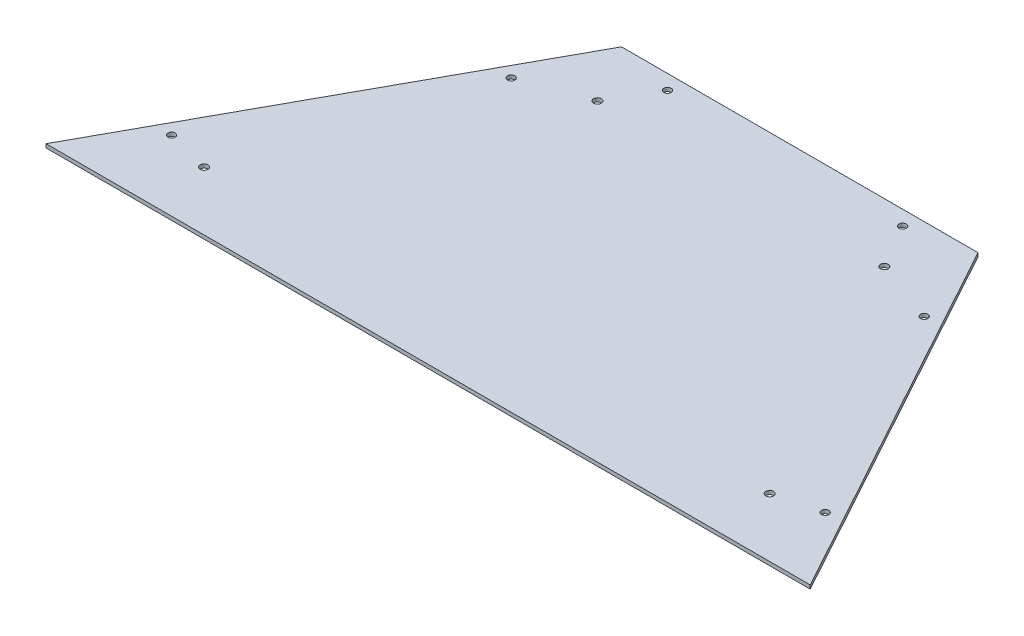
ISO-10303-21;
HEADER;
FILE_DESCRIPTION(('STEP AP214'),'2;1');
FILE_NAME('part.step','',(''),(''),'','','');
FILE_SCHEMA(('AUTOMOTIVE_DESIGN { 1 0 10303 214 1 1 1 1 }'));
ENDSEC;
DATA;
#1=APPLICATION_CONTEXT('core data for automotive mechanical design processes');
#2=APPLICATION_PROTOCOL_DEFINITION('international standard','automotive_design',2000,#1);
#3=PRODUCT_CONTEXT('',#1,'mechanical');
#4=PRODUCT('Part','Part','',(#3));
#5=PRODUCT_RELATED_PRODUCT_CATEGORY('part','',(#4));
#6=PRODUCT_DEFINITION_FORMATION('','',#4);
#7=PRODUCT_DEFINITION_CONTEXT('part definition',#1,'design');
#8=PRODUCT_DEFINITION('design','',#6,#7);
#9=PRODUCT_DEFINITION_SHAPE('','',#8);
#10=(LENGTH_UNIT() NAMED_UNIT(*) SI_UNIT(.MILLI.,.METRE.));
#11=(NAMED_UNIT(*) PLANE_ANGLE_UNIT() SI_UNIT($,.RADIAN.));
#12=(NAMED_UNIT(*) SI_UNIT($,.STERADIAN.) SOLID_ANGLE_UNIT());
#13=UNCERTAINTY_MEASURE_WITH_UNIT(LENGTH_MEASURE(1.E-05),#10,'distance_accuracy_value','');
#14=(GEOMETRIC_REPRESENTATION_CONTEXT(3) GLOBAL_UNCERTAINTY_ASSIGNED_CONTEXT((#13)) GLOBAL_UNIT_ASSIGNED_CONTEXT((#10,
#11,#12)) REPRESENTATION_CONTEXT('',''));
#15=CARTESIAN_POINT('',(0.,0.,0.));
#16=DIRECTION('',(0.,0.,1.));
#17=DIRECTION('',(1.,0.,0.));
#18=AXIS2_PLACEMENT_3D('',#15,#16,#17);
#19=CARTESIAN_POINT('',(0.,3.175,0.));
#20=DIRECTION('',(0.,-1.,0.));
#21=DIRECTION('',(0.,0.,-1.));
#22=AXIS2_PLACEMENT_3D('',#19,#20,#21);
#23=PLANE('',#22);
#24=CARTESIAN_POINT('',(-244.348,3.175,-50.7999999999999));
#25=DIRECTION('',(0.,1.,0.));
#26=DIRECTION('',(0.,0.,1.));
#27=AXIS2_PLACEMENT_3D('',#24,#25,#26);
#28=CIRCLE('',#27,3.37819999999989);
#29=CARTESIAN_POINT('',(-244.348,3.175,-47.4218));
#30=VERTEX_POINT('',#29);
#31=EDGE_CURVE('E164',#30,#30,#28,.T.);
#32=ORIENTED_EDGE('',*,*,#31,.F.);
#33=EDGE_LOOP('',(#32));
#34=FACE_BOUND('',#33,.T.);
#35=CARTESIAN_POINT('',(244.348,3.175,-50.7999999999999));
#36=DIRECTION('',(0.,1.,0.));
#37=DIRECTION('',(0.,0.,1.));
#38=AXIS2_PLACEMENT_3D('',#35,#36,#37);
#39=CIRCLE('',#38,3.37819999999989);
#40=CARTESIAN_POINT('',(244.348,3.175,-47.4218));
#41=VERTEX_POINT('',#40);
#42=EDGE_CURVE('E158',#41,#41,#39,.T.);
#43=ORIENTED_EDGE('',*,*,#42,.F.);
#44=EDGE_LOOP('',(#43));
#45=FACE_BOUND('',#44,.T.);
#46=CARTESIAN_POINT('',(123.952,3.175,-270.256));
#47=DIRECTION('',(0.,1.,0.));
#48=DIRECTION('',(0.,0.,1.));
#49=AXIS2_PLACEMENT_3D('',#46,#47,#48);
#50=CIRCLE('',#49,3.37819999999989);
#51=CARTESIAN_POINT('',(123.952,3.175,-266.8778));
#52=VERTEX_POINT('',#51);
#53=EDGE_CURVE('E152',#52,#52,#50,.T.);
#54=ORIENTED_EDGE('',*,*,#53,.F.);
#55=EDGE_LOOP('',(#54));
#56=FACE_BOUND('',#55,.T.);
#57=CARTESIAN_POINT('',(-282.418345658024,3.175,-60.7012644707171));
#58=DIRECTION('',(0.,1.,0.));
#59=DIRECTION('',(0.,0.,1.));
#60=AXIS2_PLACEMENT_3D('',#57,#58,#59);
#61=CIRCLE('',#60,3.17499999999987);
#62=CARTESIAN_POINT('',(-282.418345658024,3.175,-57.5262644707173));
#63=VERTEX_POINT('',#62);
#64=EDGE_CURVE('E146',#63,#63,#61,.T.);
#65=ORIENTED_EDGE('',*,*,#64,.F.);
#66=EDGE_LOOP('',(#65));
#67=FACE_BOUND('',#66,.T.);
#68=CARTESIAN_POINT('',(-178.463561330701,3.175,-250.216315407205));
#69=DIRECTION('',(0.,1.,0.));
#70=DIRECTION('',(0.,0.,1.));
#71=AXIS2_PLACEMENT_3D('',#68,#69,#70);
#72=CIRCLE('',#71,3.1749999999999);
#73=CARTESIAN_POINT('',(-178.463561330701,3.175,-247.041315407205));
#74=VERTEX_POINT('',#73);
#75=EDGE_CURVE('E140',#74,#74,#72,.T.);
#76=ORIENTED_EDGE('',*,*,#75,.F.);
#77=EDGE_LOOP('',(#76));
#78=FACE_BOUND('',#77,.T.);
#79=CARTESIAN_POINT('',(-101.6,3.175,-308.42891122258));
#80=DIRECTION('',(0.,1.,0.));
#81=DIRECTION('',(0.,0.,1.));
#82=AXIS2_PLACEMENT_3D('',#79,#80,#81);
#83=CIRCLE('',#82,3.17499999999989);
#84=CARTESIAN_POINT('',(-101.6,3.175,-305.253911222581));
#85=VERTEX_POINT('',#84);
#86=EDGE_CURVE('E134',#85,#85,#83,.T.);
#87=ORIENTED_EDGE('',*,*,#86,.F.);
#88=EDGE_LOOP('',(#87));
#89=FACE_BOUND('',#88,.T.);
#90=CARTESIAN_POINT('',(282.418345658024,3.175,-60.7012644707171));
#91=DIRECTION('',(0.,1.,0.));
#92=DIRECTION('',(0.,0.,1.));
#93=AXIS2_PLACEMENT_3D('',#90,#91,#92);
#94=CIRCLE('',#93,3.17499999999987);
#95=CARTESIAN_POINT('',(282.418345658024,3.175,-57.5262644707172));
#96=VERTEX_POINT('',#95);
#97=EDGE_CURVE('E128',#96,#96,#94,.T.);
#98=ORIENTED_EDGE('',*,*,#97,.F.);
#99=EDGE_LOOP('',(#98));
#100=FACE_BOUND('',#99,.T.);
#101=CARTESIAN_POINT('',(178.463561330701,3.175,-250.216315407205));
#102=DIRECTION('',(0.,1.,0.));
#103=DIRECTION('',(0.,0.,1.));
#104=AXIS2_PLACEMENT_3D('',#101,#102,#103);
#105=CIRCLE('',#104,3.1749999999999);
#106=CARTESIAN_POINT('',(178.463561330701,3.175,-247.041315407205));
#107=VERTEX_POINT('',#106);
#108=EDGE_CURVE('E122',#107,#107,#105,.T.);
#109=ORIENTED_EDGE('',*,*,#108,.F.);
#110=EDGE_LOOP('',(#109));
#111=FACE_BOUND('',#110,.T.);
#112=CARTESIAN_POINT('',(101.6,3.175,-308.42891122258));
#113=DIRECTION('',(0.,1.,0.));
#114=DIRECTION('',(0.,0.,1.));
#115=AXIS2_PLACEMENT_3D('',#112,#113,#114);
#116=CIRCLE('',#115,3.17499999999989);
#117=CARTESIAN_POINT('',(101.6,3.175,-305.253911222581));
#118=VERTEX_POINT('',#117);
#119=EDGE_CURVE('E116',#118,#118,#116,.T.);
#120=ORIENTED_EDGE('',*,*,#119,.F.);
#121=EDGE_LOOP('',(#120));
#122=FACE_BOUND('',#121,.T.);
#123=DIRECTION('',(1.,0.,0.));
#124=VECTOR('',#123,1.);
#125=CARTESIAN_POINT('',(330.2,3.175,1.66533453693773E-13));
#126=LINE('',#125,#124);
#127=CARTESIAN_POINT('',(-330.2,3.175,0.));
#128=VERTEX_POINT('',#127);
#129=CARTESIAN_POINT('',(330.2,3.175,1.66533453693773E-13));
#130=VERTEX_POINT('',#129);
#131=EDGE_CURVE('E87',#128,#130,#126,.T.);
#132=ORIENTED_EDGE('',*,*,#131,.T.);
#133=DIRECTION('',(-0.480929264909847,0.,-0.876759398098061));
#134=VECTOR('',#133,1.);
#135=CARTESIAN_POINT('',(154.051,3.175,-321.12891122258));
#136=LINE('',#135,#134);
#137=CARTESIAN_POINT('',(154.051,3.175,-321.12891122258));
#138=VERTEX_POINT('',#137);
#139=EDGE_CURVE('E82',#130,#138,#136,.T.);
#140=ORIENTED_EDGE('',*,*,#139,.T.);
#141=DIRECTION('',(-1.,0.,0.));
#142=VECTOR('',#141,1.);
#143=CARTESIAN_POINT('',(-154.051,3.175,-321.12891122258));
#144=LINE('',#143,#142);
#145=CARTESIAN_POINT('',(-154.051,3.175,-321.12891122258));
#146=VERTEX_POINT('',#145);
#147=EDGE_CURVE('E85',#138,#146,#144,.T.);
#148=ORIENTED_EDGE('',*,*,#147,.T.);
#149=DIRECTION('',(-0.480929264909847,0.,0.876759398098061));
#150=VECTOR('',#149,1.);
#151=CARTESIAN_POINT('',(-330.2,3.175,0.));
#152=LINE('',#151,#150);
#153=EDGE_CURVE('E52',#146,#128,#152,.T.);
#154=ORIENTED_EDGE('',*,*,#153,.T.);
#155=EDGE_LOOP('',(#132,#140,#148,#154));
#156=FACE_BOUND('',#155,.T.);
#157=CARTESIAN_POINT('',(-123.952,3.175,-270.256));
#158=DIRECTION('',(0.,1.,0.));
#159=DIRECTION('',(0.,0.,1.));
#160=AXIS2_PLACEMENT_3D('',#157,#158,#159);
#161=CIRCLE('',#160,3.37819999999989);
#162=CARTESIAN_POINT('',(-123.952,3.175,-266.8778));
#163=VERTEX_POINT('',#162);
#164=EDGE_CURVE('E170',#163,#163,#161,.T.);
#165=ORIENTED_EDGE('',*,*,#164,.F.);
#166=EDGE_LOOP('',(#165));
#167=FACE_BOUND('',#166,.T.);
#168=ADVANCED_FACE('F35',(#34,#45,#56,#67,#78,#89,#100,#111,#122,#156,#167),#23,.F.);
#169=CARTESIAN_POINT('',(0.,0.,0.));
#170=DIRECTION('',(0.,-1.,0.));
#171=DIRECTION('',(0.,0.,-1.));
#172=AXIS2_PLACEMENT_3D('',#169,#170,#171);
#173=PLANE('',#172);
#174=CARTESIAN_POINT('',(-123.952,0.,-270.256));
#175=DIRECTION('',(0.,1.,0.));
#176=DIRECTION('',(0.,0.,1.));
#177=AXIS2_PLACEMENT_3D('',#174,#175,#176);
#178=CIRCLE('',#177,3.37819999999989);
#179=CARTESIAN_POINT('',(-123.952,0.,-266.8778));
#180=VERTEX_POINT('',#179);
#181=EDGE_CURVE('E167',#180,#180,#178,.T.);
#182=ORIENTED_EDGE('',*,*,#181,.T.);
#183=EDGE_LOOP('',(#182));
#184=FACE_BOUND('',#183,.T.);
#185=CARTESIAN_POINT('',(-244.348,0.,-50.7999999999999));
#186=DIRECTION('',(0.,1.,0.));
#187=DIRECTION('',(0.,0.,1.));
#188=AXIS2_PLACEMENT_3D('',#185,#186,#187);
#189=CIRCLE('',#188,3.37819999999989);
#190=CARTESIAN_POINT('',(-244.348,0.,-47.4218));
#191=VERTEX_POINT('',#190);
#192=EDGE_CURVE('E161',#191,#191,#189,.T.);
#193=ORIENTED_EDGE('',*,*,#192,.T.);
#194=EDGE_LOOP('',(#193));
#195=FACE_BOUND('',#194,.T.);
#196=CARTESIAN_POINT('',(244.348,0.,-50.7999999999999));
#197=DIRECTION('',(0.,1.,0.));
#198=DIRECTION('',(0.,0.,1.));
#199=AXIS2_PLACEMENT_3D('',#196,#197,#198);
#200=CIRCLE('',#199,3.37819999999989);
#201=CARTESIAN_POINT('',(244.348,0.,-47.4218));
#202=VERTEX_POINT('',#201);
#203=EDGE_CURVE('E155',#202,#202,#200,.T.);
#204=ORIENTED_EDGE('',*,*,#203,.T.);
#205=EDGE_LOOP('',(#204));
#206=FACE_BOUND('',#205,.T.);
#207=CARTESIAN_POINT('',(123.952,0.,-270.256));
#208=DIRECTION('',(0.,1.,0.));
#209=DIRECTION('',(0.,0.,1.));
#210=AXIS2_PLACEMENT_3D('',#207,#208,#209);
#211=CIRCLE('',#210,3.37819999999989);
#212=CARTESIAN_POINT('',(123.952,0.,-266.8778));
#213=VERTEX_POINT('',#212);
#214=EDGE_CURVE('E149',#213,#213,#211,.T.);
#215=ORIENTED_EDGE('',*,*,#214,.T.);
#216=EDGE_LOOP('',(#215));
#217=FACE_BOUND('',#216,.T.);
#218=CARTESIAN_POINT('',(-282.418345658024,0.,-60.7012644707171));
#219=DIRECTION('',(0.,1.,0.));
#220=DIRECTION('',(0.,0.,1.));
#221=AXIS2_PLACEMENT_3D('',#218,#219,#220);
#222=CIRCLE('',#221,3.17499999999987);
#223=CARTESIAN_POINT('',(-282.418345658024,0.,-57.5262644707173));
#224=VERTEX_POINT('',#223);
#225=EDGE_CURVE('E143',#224,#224,#222,.T.);
#226=ORIENTED_EDGE('',*,*,#225,.T.);
#227=EDGE_LOOP('',(#226));
#228=FACE_BOUND('',#227,.T.);
#229=CARTESIAN_POINT('',(-178.463561330701,0.,-250.216315407205));
#230=DIRECTION('',(0.,1.,0.));
#231=DIRECTION('',(0.,0.,1.));
#232=AXIS2_PLACEMENT_3D('',#229,#230,#231);
#233=CIRCLE('',#232,3.1749999999999);
#234=CARTESIAN_POINT('',(-178.463561330701,0.,-247.041315407205));
#235=VERTEX_POINT('',#234);
#236=EDGE_CURVE('E137',#235,#235,#233,.T.);
#237=ORIENTED_EDGE('',*,*,#236,.T.);
#238=EDGE_LOOP('',(#237));
#239=FACE_BOUND('',#238,.T.);
#240=DIRECTION('',(1.,0.,0.));
#241=VECTOR('',#240,1.);
#242=CARTESIAN_POINT('',(330.2,0.,1.66533453693773E-13));
#243=LINE('',#242,#241);
#244=CARTESIAN_POINT('',(-330.2,0.,0.));
#245=VERTEX_POINT('',#244);
#246=CARTESIAN_POINT('',(330.2,0.,1.66533453693773E-13));
#247=VERTEX_POINT('',#246);
#248=EDGE_CURVE('E99',#245,#247,#243,.T.);
#249=ORIENTED_EDGE('',*,*,#248,.F.);
#250=DIRECTION('',(-0.480929264909847,0.,0.876759398098061));
#251=VECTOR('',#250,1.);
#252=CARTESIAN_POINT('',(-330.2,0.,0.));
#253=LINE('',#252,#251);
#254=CARTESIAN_POINT('',(-154.051,0.,-321.12891122258));
#255=VERTEX_POINT('',#254);
#256=EDGE_CURVE('E75',#255,#245,#253,.T.);
#257=ORIENTED_EDGE('',*,*,#256,.F.);
#258=DIRECTION('',(-1.,0.,0.));
#259=VECTOR('',#258,1.);
#260=CARTESIAN_POINT('',(-154.051,0.,-321.12891122258));
#261=LINE('',#260,#259);
#262=CARTESIAN_POINT('',(154.051,0.,-321.12891122258));
#263=VERTEX_POINT('',#262);
#264=EDGE_CURVE('E69',#263,#255,#261,.T.);
#265=ORIENTED_EDGE('',*,*,#264,.F.);
#266=DIRECTION('',(-0.480929264909847,0.,-0.876759398098061));
#267=VECTOR('',#266,1.);
#268=CARTESIAN_POINT('',(154.051,0.,-321.12891122258));
#269=LINE('',#268,#267);
#270=EDGE_CURVE('E91',#247,#263,#269,.T.);
#271=ORIENTED_EDGE('',*,*,#270,.F.);
#272=EDGE_LOOP('',(#249,#257,#265,#271));
#273=FACE_BOUND('',#272,.T.);
#274=CARTESIAN_POINT('',(101.6,0.,-308.42891122258));
#275=DIRECTION('',(0.,1.,0.));
#276=DIRECTION('',(0.,0.,1.));
#277=AXIS2_PLACEMENT_3D('',#274,#275,#276);
#278=CIRCLE('',#277,3.17499999999989);
#279=CARTESIAN_POINT('',(101.6,0.,-305.253911222581));
#280=VERTEX_POINT('',#279);
#281=EDGE_CURVE('E102',#280,#280,#278,.T.);
#282=ORIENTED_EDGE('',*,*,#281,.T.);
#283=EDGE_LOOP('',(#282));
#284=FACE_BOUND('',#283,.T.);
#285=CARTESIAN_POINT('',(178.463561330701,0.,-250.216315407205));
#286=DIRECTION('',(0.,1.,0.));
#287=DIRECTION('',(0.,0.,1.));
#288=AXIS2_PLACEMENT_3D('',#285,#286,#287);
#289=CIRCLE('',#288,3.1749999999999);
#290=CARTESIAN_POINT('',(178.463561330701,0.,-247.041315407205));
#291=VERTEX_POINT('',#290);
#292=EDGE_CURVE('E119',#291,#291,#289,.T.);
#293=ORIENTED_EDGE('',*,*,#292,.T.);
#294=EDGE_LOOP('',(#293));
#295=FACE_BOUND('',#294,.T.);
#296=CARTESIAN_POINT('',(282.418345658024,0.,-60.7012644707171));
#297=DIRECTION('',(0.,1.,0.));
#298=DIRECTION('',(0.,0.,1.));
#299=AXIS2_PLACEMENT_3D('',#296,#297,#298);
#300=CIRCLE('',#299,3.17499999999987);
#301=CARTESIAN_POINT('',(282.418345658024,0.,-57.5262644707172));
#302=VERTEX_POINT('',#301);
#303=EDGE_CURVE('E125',#302,#302,#300,.T.);
#304=ORIENTED_EDGE('',*,*,#303,.T.);
#305=EDGE_LOOP('',(#304));
#306=FACE_BOUND('',#305,.T.);
#307=CARTESIAN_POINT('',(-101.6,0.,-308.42891122258));
#308=DIRECTION('',(0.,1.,0.));
#309=DIRECTION('',(0.,0.,1.));
#310=AXIS2_PLACEMENT_3D('',#307,#308,#309);
#311=CIRCLE('',#310,3.17499999999989);
#312=CARTESIAN_POINT('',(-101.6,0.,-305.253911222581));
#313=VERTEX_POINT('',#312);
#314=EDGE_CURVE('E131',#313,#313,#311,.T.);
#315=ORIENTED_EDGE('',*,*,#314,.T.);
#316=EDGE_LOOP('',(#315));
#317=FACE_BOUND('',#316,.T.);
#318=ADVANCED_FACE('F110',(#184,#195,#206,#217,#228,#239,#273,#284,#295,#306,#317),#173,.T.);
#319=CARTESIAN_POINT('',(330.2,3.175,1.66533453693773E-13));
#320=DIRECTION('',(0.,0.,-1.));
#321=DIRECTION('',(-1.,0.,0.));
#322=AXIS2_PLACEMENT_3D('',#319,#320,#321);
#323=PLANE('',#322);
#324=ORIENTED_EDGE('',*,*,#248,.T.);
#325=DIRECTION('',(0.,-1.,0.));
#326=VECTOR('',#325,1.);
#327=CARTESIAN_POINT('',(330.2,3.175,1.66533453693773E-13));
#328=LINE('',#327,#326);
#329=EDGE_CURVE('E11',#130,#247,#328,.T.);
#330=ORIENTED_EDGE('',*,*,#329,.F.);
#331=ORIENTED_EDGE('',*,*,#131,.F.);
#332=DIRECTION('',(0.,-1.,0.));
#333=VECTOR('',#332,1.);
#334=CARTESIAN_POINT('',(-330.2,3.175,0.));
#335=LINE('',#334,#333);
#336=EDGE_CURVE('E95',#128,#245,#335,.T.);
#337=ORIENTED_EDGE('',*,*,#336,.T.);
#338=EDGE_LOOP('',(#324,#330,#331,#337));
#339=FACE_BOUND('',#338,.T.);
#340=ADVANCED_FACE('F37',(#339),#323,.F.);
#341=CARTESIAN_POINT('',(154.051,3.175,-321.12891122258));
#342=DIRECTION('',(-0.876759398098061,0.,0.480929264909847));
#343=DIRECTION('',(0.480929264909847,0.,0.876759398098061));
#344=AXIS2_PLACEMENT_3D('',#341,#342,#343);
#345=PLANE('',#344);
#346=ORIENTED_EDGE('',*,*,#270,.T.);
#347=DIRECTION('',(0.,-1.,0.));
#348=VECTOR('',#347,1.);
#349=CARTESIAN_POINT('',(154.051,3.175,-321.12891122258));
#350=LINE('',#349,#348);
#351=EDGE_CURVE('E44',#138,#263,#350,.T.);
#352=ORIENTED_EDGE('',*,*,#351,.F.);
#353=ORIENTED_EDGE('',*,*,#139,.F.);
#354=ORIENTED_EDGE('',*,*,#329,.T.);
#355=EDGE_LOOP('',(#346,#352,#353,#354));
#356=FACE_BOUND('',#355,.T.);
#357=ADVANCED_FACE('F90',(#356),#345,.F.);
#358=CARTESIAN_POINT('',(-154.051,3.175,-321.12891122258));
#359=DIRECTION('',(0.,0.,1.));
#360=DIRECTION('',(1.,0.,0.));
#361=AXIS2_PLACEMENT_3D('',#358,#359,#360);
#362=PLANE('',#361);
#363=ORIENTED_EDGE('',*,*,#264,.T.);
#364=DIRECTION('',(0.,-1.,0.));
#365=VECTOR('',#364,1.);
#366=CARTESIAN_POINT('',(-154.051,3.175,-321.12891122258));
#367=LINE('',#366,#365);
#368=EDGE_CURVE('E92',#146,#255,#367,.T.);
#369=ORIENTED_EDGE('',*,*,#368,.F.);
#370=ORIENTED_EDGE('',*,*,#147,.F.);
#371=ORIENTED_EDGE('',*,*,#351,.T.);
#372=EDGE_LOOP('',(#363,#369,#370,#371));
#373=FACE_BOUND('',#372,.T.);
#374=ADVANCED_FACE('F93',(#373),#362,.F.);
#375=CARTESIAN_POINT('',(-330.2,3.175,0.));
#376=DIRECTION('',(0.876759398098061,0.,0.480929264909847));
#377=DIRECTION('',(0.480929264909847,0.,-0.876759398098061));
#378=AXIS2_PLACEMENT_3D('',#375,#376,#377);
#379=PLANE('',#378);
#380=ORIENTED_EDGE('',*,*,#256,.T.);
#381=ORIENTED_EDGE('',*,*,#336,.F.);
#382=ORIENTED_EDGE('',*,*,#153,.F.);
#383=ORIENTED_EDGE('',*,*,#368,.T.);
#384=EDGE_LOOP('',(#380,#381,#382,#383));
#385=FACE_BOUND('',#384,.T.);
#386=ADVANCED_FACE('F107',(#385),#379,.F.);
#387=CARTESIAN_POINT('',(101.6,3.175,-308.42891122258));
#388=DIRECTION('',(0.,1.,0.));
#389=DIRECTION('',(0.,0.,1.));
#390=AXIS2_PLACEMENT_3D('',#387,#388,#389);
#391=CYLINDRICAL_SURFACE('',#390,3.17499999999989);
#392=ORIENTED_EDGE('',*,*,#281,.F.);
#393=EDGE_LOOP('',(#392));
#394=FACE_BOUND('',#393,.T.);
#395=ORIENTED_EDGE('',*,*,#119,.T.);
#396=EDGE_LOOP('',(#395));
#397=FACE_BOUND('',#396,.T.);
#398=ADVANCED_FACE('F186',(#394,#397),#391,.F.);
#399=CARTESIAN_POINT('',(178.463561330701,3.175,-250.216315407205));
#400=DIRECTION('',(0.,1.,0.));
#401=DIRECTION('',(0.,0.,1.));
#402=AXIS2_PLACEMENT_3D('',#399,#400,#401);
#403=CYLINDRICAL_SURFACE('',#402,3.1749999999999);
#404=ORIENTED_EDGE('',*,*,#292,.F.);
#405=EDGE_LOOP('',(#404));
#406=FACE_BOUND('',#405,.T.);
#407=ORIENTED_EDGE('',*,*,#108,.T.);
#408=EDGE_LOOP('',(#407));
#409=FACE_BOUND('',#408,.T.);
#410=ADVANCED_FACE('F266',(#406,#409),#403,.F.);
#411=CARTESIAN_POINT('',(282.418345658024,3.175,-60.7012644707171));
#412=DIRECTION('',(0.,1.,0.));
#413=DIRECTION('',(0.,0.,1.));
#414=AXIS2_PLACEMENT_3D('',#411,#412,#413);
#415=CYLINDRICAL_SURFACE('',#414,3.17499999999987);
#416=ORIENTED_EDGE('',*,*,#303,.F.);
#417=EDGE_LOOP('',(#416));
#418=FACE_BOUND('',#417,.T.);
#419=ORIENTED_EDGE('',*,*,#97,.T.);
#420=EDGE_LOOP('',(#419));
#421=FACE_BOUND('',#420,.T.);
#422=ADVANCED_FACE('F263',(#418,#421),#415,.F.);
#423=CARTESIAN_POINT('',(-101.6,3.175,-308.42891122258));
#424=DIRECTION('',(0.,1.,0.));
#425=DIRECTION('',(0.,0.,1.));
#426=AXIS2_PLACEMENT_3D('',#423,#424,#425);
#427=CYLINDRICAL_SURFACE('',#426,3.17499999999989);
#428=ORIENTED_EDGE('',*,*,#314,.F.);
#429=EDGE_LOOP('',(#428));
#430=FACE_BOUND('',#429,.T.);
#431=ORIENTED_EDGE('',*,*,#86,.T.);
#432=EDGE_LOOP('',(#431));
#433=FACE_BOUND('',#432,.T.);
#434=ADVANCED_FACE('F259',(#430,#433),#427,.F.);
#435=CARTESIAN_POINT('',(-178.463561330701,3.175,-250.216315407205));
#436=DIRECTION('',(0.,1.,0.));
#437=DIRECTION('',(0.,0.,1.));
#438=AXIS2_PLACEMENT_3D('',#435,#436,#437);
#439=CYLINDRICAL_SURFACE('',#438,3.1749999999999);
#440=ORIENTED_EDGE('',*,*,#236,.F.);
#441=EDGE_LOOP('',(#440));
#442=FACE_BOUND('',#441,.T.);
#443=ORIENTED_EDGE('',*,*,#75,.T.);
#444=EDGE_LOOP('',(#443));
#445=FACE_BOUND('',#444,.T.);
#446=ADVANCED_FACE('F255',(#442,#445),#439,.F.);
#447=CARTESIAN_POINT('',(-282.418345658024,3.175,-60.7012644707171));
#448=DIRECTION('',(0.,1.,0.));
#449=DIRECTION('',(0.,0.,1.));
#450=AXIS2_PLACEMENT_3D('',#447,#448,#449);
#451=CYLINDRICAL_SURFACE('',#450,3.17499999999987);
#452=ORIENTED_EDGE('',*,*,#225,.F.);
#453=EDGE_LOOP('',(#452));
#454=FACE_BOUND('',#453,.T.);
#455=ORIENTED_EDGE('',*,*,#64,.T.);
#456=EDGE_LOOP('',(#455));
#457=FACE_BOUND('',#456,.T.);
#458=ADVANCED_FACE('F218',(#454,#457),#451,.F.);
#459=CARTESIAN_POINT('',(123.952,3.175,-270.256));
#460=DIRECTION('',(0.,1.,0.));
#461=DIRECTION('',(0.,0.,1.));
#462=AXIS2_PLACEMENT_3D('',#459,#460,#461);
#463=CYLINDRICAL_SURFACE('',#462,3.37819999999989);
#464=ORIENTED_EDGE('',*,*,#214,.F.);
#465=EDGE_LOOP('',(#464));
#466=FACE_BOUND('',#465,.T.);
#467=ORIENTED_EDGE('',*,*,#53,.T.);
#468=EDGE_LOOP('',(#467));
#469=FACE_BOUND('',#468,.T.);
#470=ADVANCED_FACE('F212',(#466,#469),#463,.F.);
#471=CARTESIAN_POINT('',(244.348,3.175,-50.7999999999999));
#472=DIRECTION('',(0.,1.,0.));
#473=DIRECTION('',(0.,0.,1.));
#474=AXIS2_PLACEMENT_3D('',#471,#472,#473);
#475=CYLINDRICAL_SURFACE('',#474,3.37819999999989);
#476=ORIENTED_EDGE('',*,*,#203,.F.);
#477=EDGE_LOOP('',(#476));
#478=FACE_BOUND('',#477,.T.);
#479=ORIENTED_EDGE('',*,*,#42,.T.);
#480=EDGE_LOOP('',(#479));
#481=FACE_BOUND('',#480,.T.);
#482=ADVANCED_FACE('F217',(#478,#481),#475,.F.);
#483=CARTESIAN_POINT('',(-244.348,3.175,-50.7999999999999));
#484=DIRECTION('',(0.,1.,0.));
#485=DIRECTION('',(0.,0.,1.));
#486=AXIS2_PLACEMENT_3D('',#483,#484,#485);
#487=CYLINDRICAL_SURFACE('',#486,3.37819999999989);
#488=ORIENTED_EDGE('',*,*,#192,.F.);
#489=EDGE_LOOP('',(#488));
#490=FACE_BOUND('',#489,.T.);
#491=ORIENTED_EDGE('',*,*,#31,.T.);
#492=EDGE_LOOP('',(#491));
#493=FACE_BOUND('',#492,.T.);
#494=ADVANCED_FACE('F229',(#490,#493),#487,.F.);
#495=CARTESIAN_POINT('',(-123.952,3.175,-270.256));
#496=DIRECTION('',(0.,1.,0.));
#497=DIRECTION('',(0.,0.,1.));
#498=AXIS2_PLACEMENT_3D('',#495,#496,#497);
#499=CYLINDRICAL_SURFACE('',#498,3.37819999999989);
#500=ORIENTED_EDGE('',*,*,#181,.F.);
#501=EDGE_LOOP('',(#500));
#502=FACE_BOUND('',#501,.T.);
#503=ORIENTED_EDGE('',*,*,#164,.T.);
#504=EDGE_LOOP('',(#503));
#505=FACE_BOUND('',#504,.T.);
#506=ADVANCED_FACE('F174',(#502,#505),#499,.F.);
#507=CLOSED_SHELL('',(#168,#318,#340,#357,#374,#386,#398,#410,#422,#434,#446,#458,#470,#482,
#494,#506));
#508=MANIFOLD_SOLID_BREP('B2',#507);
#509=ADVANCED_BREP_SHAPE_REPRESENTATION('',(#18,#508),#14);
#510=SHAPE_DEFINITION_REPRESENTATION(#9,#509);
ENDSEC;
END-ISO-10303-21;
